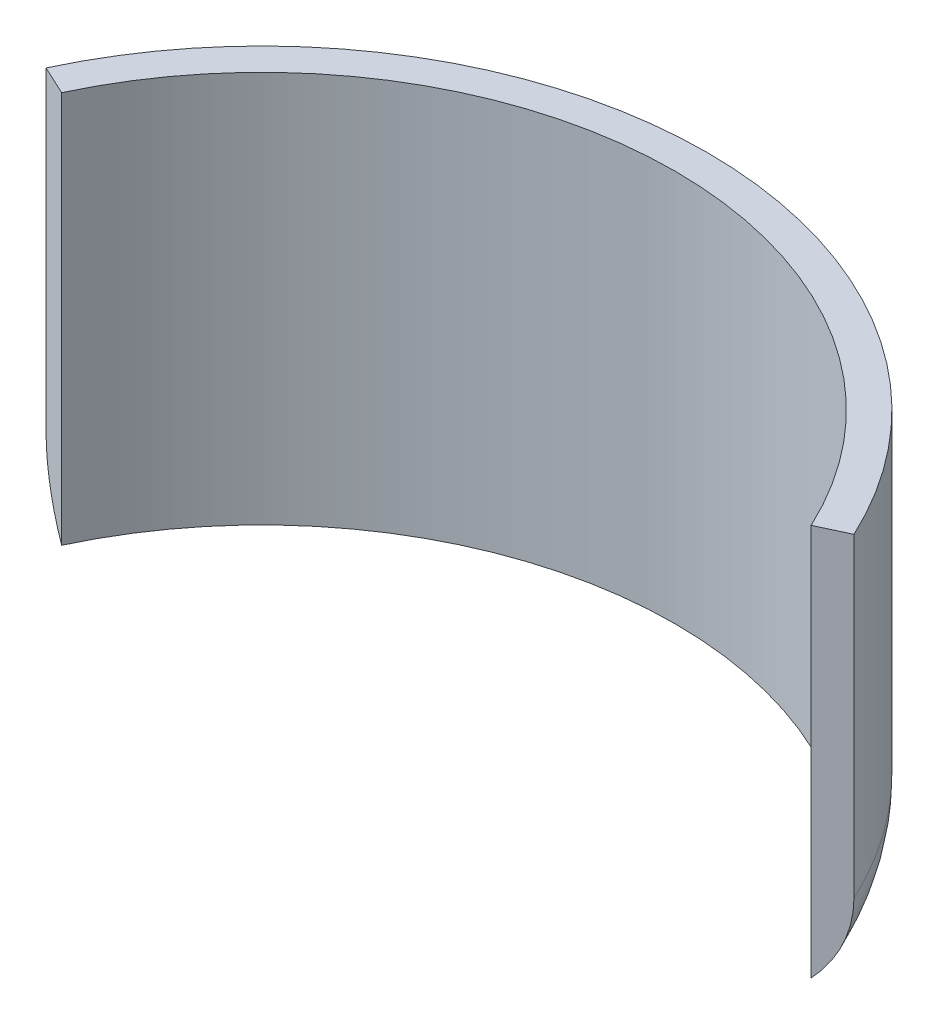
ISO-10303-21;
HEADER;
FILE_DESCRIPTION(('STEP AP214'),'2;1');
FILE_NAME('part.step','',(''),(''),'','','');
FILE_SCHEMA(('AUTOMOTIVE_DESIGN { 1 0 10303 214 1 1 1 1 }'));
ENDSEC;
DATA;
#1=APPLICATION_CONTEXT('core data for automotive mechanical design processes');
#2=APPLICATION_PROTOCOL_DEFINITION('international standard','automotive_design',2000,#1);
#3=PRODUCT_CONTEXT('',#1,'mechanical');
#4=PRODUCT('Part','Part','',(#3));
#5=PRODUCT_RELATED_PRODUCT_CATEGORY('part','',(#4));
#6=PRODUCT_DEFINITION_FORMATION('','',#4);
#7=PRODUCT_DEFINITION_CONTEXT('part definition',#1,'design');
#8=PRODUCT_DEFINITION('design','',#6,#7);
#9=PRODUCT_DEFINITION_SHAPE('','',#8);
#10=(LENGTH_UNIT() NAMED_UNIT(*) SI_UNIT(.MILLI.,.METRE.));
#11=(NAMED_UNIT(*) PLANE_ANGLE_UNIT() SI_UNIT($,.RADIAN.));
#12=(NAMED_UNIT(*) SI_UNIT($,.STERADIAN.) SOLID_ANGLE_UNIT());
#13=UNCERTAINTY_MEASURE_WITH_UNIT(LENGTH_MEASURE(1.E-05),#10,'distance_accuracy_value','');
#14=(GEOMETRIC_REPRESENTATION_CONTEXT(3) GLOBAL_UNCERTAINTY_ASSIGNED_CONTEXT((#13)) GLOBAL_UNIT_ASSIGNED_CONTEXT((#10,
#11,#12)) REPRESENTATION_CONTEXT('',''));
#15=CARTESIAN_POINT('',(0.,0.,0.));
#16=DIRECTION('',(0.,0.,1.));
#17=DIRECTION('',(1.,0.,0.));
#18=AXIS2_PLACEMENT_3D('',#15,#16,#17);
#19=CARTESIAN_POINT('',(0.,51.0988032433773,40.));
#20=DIRECTION('',(0.,1.,0.));
#21=DIRECTION('',(0.,0.,1.));
#22=AXIS2_PLACEMENT_3D('',#19,#20,#21);
#23=CYLINDRICAL_SURFACE('',#22,41.5);
#24=DIRECTION('',(0.,1.,0.));
#25=VECTOR('',#24,1.);
#26=CARTESIAN_POINT('',(37.611773162021,18.25,22.4613421377611));
#27=LINE('',#26,#25);
#28=CARTESIAN_POINT('',(37.611773162021,-11.1085715714571,22.4613421377611));
#29=VERTEX_POINT('',#28);
#30=CARTESIAN_POINT('',(37.611773162021,18.25,22.4613421377611));
#31=VERTEX_POINT('',#30);
#32=EDGE_CURVE('E104',#29,#31,#27,.T.);
#33=ORIENTED_EDGE('',*,*,#32,.F.);
#34=CARTESIAN_POINT('',(0.,-11.1085715714571,40.));
#35=DIRECTION('',(0.,-1.,0.));
#36=DIRECTION('',(0.,0.,-1.));
#37=AXIS2_PLACEMENT_3D('',#34,#35,#36);
#38=CIRCLE('',#37,41.5);
#39=CARTESIAN_POINT('',(-37.611773162021,-11.1085715714571,22.4613421377611));
#40=VERTEX_POINT('',#39);
#41=EDGE_CURVE('E83',#29,#40,#38,.F.);
#42=ORIENTED_EDGE('',*,*,#41,.T.);
#43=DIRECTION('',(0.,1.,0.));
#44=VECTOR('',#43,1.);
#45=CARTESIAN_POINT('',(-37.611773162021,18.25,22.4613421377611));
#46=LINE('',#45,#44);
#47=CARTESIAN_POINT('',(-37.611773162021,18.25,22.4613421377611));
#48=VERTEX_POINT('',#47);
#49=EDGE_CURVE('E79',#40,#48,#46,.T.);
#50=ORIENTED_EDGE('',*,*,#49,.T.);
#51=CARTESIAN_POINT('',(0.,18.25,40.));
#52=DIRECTION('',(0.,1.,0.));
#53=DIRECTION('',(0.,0.,1.));
#54=AXIS2_PLACEMENT_3D('',#51,#52,#53);
#55=CIRCLE('',#54,41.5);
#56=EDGE_CURVE('E81',#31,#48,#55,.T.);
#57=ORIENTED_EDGE('',*,*,#56,.F.);
#58=EDGE_LOOP('',(#33,#42,#50,#57));
#59=FACE_BOUND('',#58,.T.);
#60=ADVANCED_FACE('F38',(#59),#23,.T.);
#61=CARTESIAN_POINT('',(34.8928498009111,18.25,23.7291969229832));
#62=DIRECTION('',(0.,-1.,0.));
#63=DIRECTION('',(0.,0.,-1.));
#64=AXIS2_PLACEMENT_3D('',#61,#62,#63);
#65=PLANE('',#64);
#66=CARTESIAN_POINT('',(0.,18.25,40.));
#67=DIRECTION('',(0.,1.,0.));
#68=DIRECTION('',(0.,0.,1.));
#69=AXIS2_PLACEMENT_3D('',#66,#67,#68);
#70=CIRCLE('',#69,38.5);
#71=CARTESIAN_POINT('',(34.8928498009111,18.25,23.7291969229832));
#72=VERTEX_POINT('',#71);
#73=CARTESIAN_POINT('',(-34.8928498009111,18.25,23.7291969229832));
#74=VERTEX_POINT('',#73);
#75=EDGE_CURVE('E96',#72,#74,#70,.T.);
#76=ORIENTED_EDGE('',*,*,#75,.F.);
#77=DIRECTION('',(-0.906307787036651,0.,0.422618261740697));
#78=VECTOR('',#77,1.);
#79=CARTESIAN_POINT('',(34.8928498009111,18.25,23.7291969229832));
#80=LINE('',#79,#78);
#81=EDGE_CURVE('E94',#31,#72,#80,.T.);
#82=ORIENTED_EDGE('',*,*,#81,.F.);
#83=ORIENTED_EDGE('',*,*,#56,.T.);
#84=DIRECTION('',(0.906307787036651,0.,0.422618261740697));
#85=VECTOR('',#84,1.);
#86=CARTESIAN_POINT('',(-34.8928498009111,18.25,23.7291969229832));
#87=LINE('',#86,#85);
#88=EDGE_CURVE('E87',#48,#74,#87,.T.);
#89=ORIENTED_EDGE('',*,*,#88,.T.);
#90=EDGE_LOOP('',(#76,#82,#83,#89));
#91=FACE_BOUND('',#90,.T.);
#92=ADVANCED_FACE('F91',(#91),#65,.F.);
#93=CARTESIAN_POINT('',(0.,51.0988032433773,40.));
#94=DIRECTION('',(0.,1.,0.));
#95=DIRECTION('',(0.,0.,1.));
#96=AXIS2_PLACEMENT_3D('',#93,#94,#95);
#97=CYLINDRICAL_SURFACE('',#96,38.5);
#98=CARTESIAN_POINT('',(0.,-18.25,40.));
#99=DIRECTION('',(0.,1.,0.));
#100=DIRECTION('',(0.,0.,1.));
#101=AXIS2_PLACEMENT_3D('',#98,#99,#100);
#102=CIRCLE('',#101,38.5);
#103=CARTESIAN_POINT('',(34.8928498009111,-18.25,23.7291969229831));
#104=VERTEX_POINT('',#103);
#105=CARTESIAN_POINT('',(-34.8928498009111,-18.25,23.7291969229832));
#106=VERTEX_POINT('',#105);
#107=EDGE_CURVE('E114',#104,#106,#102,.T.);
#108=ORIENTED_EDGE('',*,*,#107,.F.);
#109=DIRECTION('',(0.,-1.,0.));
#110=VECTOR('',#109,1.);
#111=CARTESIAN_POINT('',(34.8928498009111,18.25,23.7291969229832));
#112=LINE('',#111,#110);
#113=EDGE_CURVE('E111',#72,#104,#112,.T.);
#114=ORIENTED_EDGE('',*,*,#113,.F.);
#115=ORIENTED_EDGE('',*,*,#75,.T.);
#116=DIRECTION('',(0.,-1.,0.));
#117=VECTOR('',#116,1.);
#118=CARTESIAN_POINT('',(-34.8928498009111,18.25,23.7291969229832));
#119=LINE('',#118,#117);
#120=EDGE_CURVE('E100',#74,#106,#119,.T.);
#121=ORIENTED_EDGE('',*,*,#120,.T.);
#122=EDGE_LOOP('',(#108,#114,#115,#121));
#123=FACE_BOUND('',#122,.T.);
#124=ADVANCED_FACE('F122',(#123),#97,.F.);
#125=CARTESIAN_POINT('',(36.252311481466,0.,23.0952695303721));
#126=DIRECTION('',(0.422618261740697,0.,0.906307787036651));
#127=DIRECTION('',(0.906307787036651,0.,-0.422618261740697));
#128=AXIS2_PLACEMENT_3D('',#125,#126,#127);
#129=PLANE('',#128);
#130=ORIENTED_EDGE('',*,*,#113,.T.);
#131=CARTESIAN_POINT('',(28.5486952916545,-11.1085715714571,26.687524755168));
#132=DIRECTION('',(0.422618261740697,0.,0.906307787036651));
#133=DIRECTION('',(0.906307787036651,0.,-0.422618261740697));
#134=AXIS2_PLACEMENT_3D('',#131,#132,#133);
#135=CIRCLE('',#134,10.);
#136=EDGE_CURVE('E11',#104,#29,#135,.T.);
#137=ORIENTED_EDGE('',*,*,#136,.T.);
#138=ORIENTED_EDGE('',*,*,#32,.T.);
#139=ORIENTED_EDGE('',*,*,#81,.T.);
#140=EDGE_LOOP('',(#130,#137,#138,#139));
#141=FACE_BOUND('',#140,.T.);
#142=ADVANCED_FACE('F129',(#141),#129,.T.);
#143=CARTESIAN_POINT('',(-36.252311481466,0.,23.0952695303721));
#144=DIRECTION('',(0.422618261740697,0.,-0.906307787036651));
#145=DIRECTION('',(-0.906307787036651,0.,-0.422618261740697));
#146=AXIS2_PLACEMENT_3D('',#143,#144,#145);
#147=PLANE('',#146);
#148=ORIENTED_EDGE('',*,*,#49,.F.);
#149=CARTESIAN_POINT('',(-28.5486952916545,-11.1085715714571,26.687524755168));
#150=DIRECTION('',(0.422618261740697,0.,-0.906307787036651));
#151=DIRECTION('',(-0.906307787036651,0.,-0.422618261740697));
#152=AXIS2_PLACEMENT_3D('',#149,#150,#151);
#153=CIRCLE('',#152,10.);
#154=EDGE_CURVE('E47',#40,#106,#153,.F.);
#155=ORIENTED_EDGE('',*,*,#154,.T.);
#156=ORIENTED_EDGE('',*,*,#120,.F.);
#157=ORIENTED_EDGE('',*,*,#88,.F.);
#158=EDGE_LOOP('',(#148,#155,#156,#157));
#159=FACE_BOUND('',#158,.T.);
#160=ADVANCED_FACE('F98',(#159),#147,.F.);
#161=CARTESIAN_POINT('',(0.,-11.1085715714571,40.));
#162=DIRECTION('',(0.,-1.,0.));
#163=DIRECTION('',(0.,0.,-1.));
#164=AXIS2_PLACEMENT_3D('',#161,#162,#163);
#165=TOROIDAL_SURFACE('',#164,31.5,10.);
#166=ORIENTED_EDGE('',*,*,#136,.F.);
#167=ORIENTED_EDGE('',*,*,#107,.T.);
#168=ORIENTED_EDGE('',*,*,#154,.F.);
#169=ORIENTED_EDGE('',*,*,#41,.F.);
#170=EDGE_LOOP('',(#166,#167,#168,#169));
#171=FACE_BOUND('',#170,.T.);
#172=ADVANCED_FACE('F40',(#171),#165,.T.);
#173=CLOSED_SHELL('',(#60,#92,#124,#142,#160,#172));
#174=MANIFOLD_SOLID_BREP('B2',#173);
#175=ADVANCED_BREP_SHAPE_REPRESENTATION('',(#18,#174),#14);
#176=SHAPE_DEFINITION_REPRESENTATION(#9,#175);
ENDSEC;
END-ISO-10303-21;
